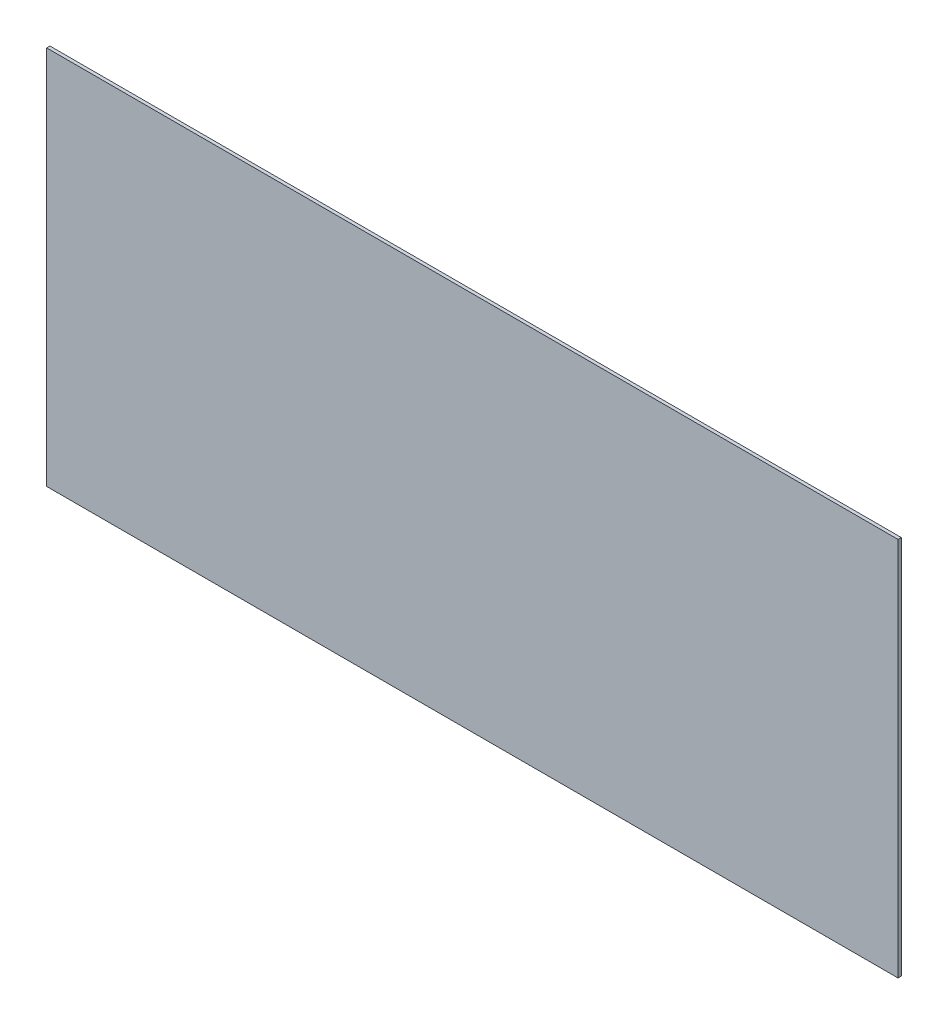
ISO-10303-21;
HEADER;
FILE_DESCRIPTION(('STEP AP214'),'2;1');
FILE_NAME('part.step','',(''),(''),'','','');
FILE_SCHEMA(('AUTOMOTIVE_DESIGN { 1 0 10303 214 1 1 1 1 }'));
ENDSEC;
DATA;
#1=APPLICATION_CONTEXT('core data for automotive mechanical design processes');
#2=APPLICATION_PROTOCOL_DEFINITION('international standard','automotive_design',2000,#1);
#3=PRODUCT_CONTEXT('',#1,'mechanical');
#4=PRODUCT('Part','Part','',(#3));
#5=PRODUCT_RELATED_PRODUCT_CATEGORY('part','',(#4));
#6=PRODUCT_DEFINITION_FORMATION('','',#4);
#7=PRODUCT_DEFINITION_CONTEXT('part definition',#1,'design');
#8=PRODUCT_DEFINITION('design','',#6,#7);
#9=PRODUCT_DEFINITION_SHAPE('','',#8);
#10=(LENGTH_UNIT() NAMED_UNIT(*) SI_UNIT(.MILLI.,.METRE.));
#11=(NAMED_UNIT(*) PLANE_ANGLE_UNIT() SI_UNIT($,.RADIAN.));
#12=(NAMED_UNIT(*) SI_UNIT($,.STERADIAN.) SOLID_ANGLE_UNIT());
#13=UNCERTAINTY_MEASURE_WITH_UNIT(LENGTH_MEASURE(1.E-05),#10,'distance_accuracy_value','');
#14=(GEOMETRIC_REPRESENTATION_CONTEXT(3) GLOBAL_UNCERTAINTY_ASSIGNED_CONTEXT((#13)) GLOBAL_UNIT_ASSIGNED_CONTEXT((#10,
#11,#12)) REPRESENTATION_CONTEXT('',''));
#15=CARTESIAN_POINT('',(0.,0.,0.));
#16=DIRECTION('',(0.,0.,1.));
#17=DIRECTION('',(1.,0.,0.));
#18=AXIS2_PLACEMENT_3D('',#15,#16,#17);
#19=CARTESIAN_POINT('',(0.,0.,0.1));
#20=DIRECTION('',(1.,0.,0.));
#21=DIRECTION('',(0.,0.,-1.));
#22=AXIS2_PLACEMENT_3D('',#19,#20,#21);
#23=PLANE('',#22);
#24=DIRECTION('',(0.,-1.,0.));
#25=VECTOR('',#24,1.);
#26=CARTESIAN_POINT('',(0.,0.,0.));
#27=LINE('',#26,#25);
#28=CARTESIAN_POINT('',(0.,11.6,0.));
#29=VERTEX_POINT('',#28);
#30=CARTESIAN_POINT('',(0.,0.,0.));
#31=VERTEX_POINT('',#30);
#32=EDGE_CURVE('E107',#29,#31,#27,.T.);
#33=ORIENTED_EDGE('',*,*,#32,.T.);
#34=DIRECTION('',(0.,0.,-1.));
#35=VECTOR('',#34,1.);
#36=CARTESIAN_POINT('',(0.,0.,0.1));
#37=LINE('',#36,#35);
#38=CARTESIAN_POINT('',(0.,0.,0.1));
#39=VERTEX_POINT('',#38);
#40=EDGE_CURVE('E11',#39,#31,#37,.T.);
#41=ORIENTED_EDGE('',*,*,#40,.F.);
#42=DIRECTION('',(0.,-1.,0.));
#43=VECTOR('',#42,1.);
#44=CARTESIAN_POINT('',(0.,0.,0.1));
#45=LINE('',#44,#43);
#46=CARTESIAN_POINT('',(0.,11.6,0.1));
#47=VERTEX_POINT('',#46);
#48=EDGE_CURVE('E91',#47,#39,#45,.T.);
#49=ORIENTED_EDGE('',*,*,#48,.F.);
#50=DIRECTION('',(0.,0.,-1.));
#51=VECTOR('',#50,1.);
#52=CARTESIAN_POINT('',(0.,11.6,0.1));
#53=LINE('',#52,#51);
#54=EDGE_CURVE('E103',#47,#29,#53,.T.);
#55=ORIENTED_EDGE('',*,*,#54,.T.);
#56=EDGE_LOOP('',(#33,#41,#49,#55));
#57=FACE_BOUND('',#56,.T.);
#58=ADVANCED_FACE('F39',(#57),#23,.F.);
#59=CARTESIAN_POINT('',(0.,0.,0.1));
#60=DIRECTION('',(0.,1.,0.));
#61=DIRECTION('',(0.,0.,1.));
#62=AXIS2_PLACEMENT_3D('',#59,#60,#61);
#63=PLANE('',#62);
#64=DIRECTION('',(1.,0.,0.));
#65=VECTOR('',#64,1.);
#66=CARTESIAN_POINT('',(0.,0.,0.));
#67=LINE('',#66,#65);
#68=CARTESIAN_POINT('',(26.,0.,0.));
#69=VERTEX_POINT('',#68);
#70=EDGE_CURVE('E96',#31,#69,#67,.T.);
#71=ORIENTED_EDGE('',*,*,#70,.T.);
#72=DIRECTION('',(0.,0.,-1.));
#73=VECTOR('',#72,1.);
#74=CARTESIAN_POINT('',(26.,0.,0.1));
#75=LINE('',#74,#73);
#76=CARTESIAN_POINT('',(26.,0.,0.1));
#77=VERTEX_POINT('',#76);
#78=EDGE_CURVE('E48',#77,#69,#75,.T.);
#79=ORIENTED_EDGE('',*,*,#78,.F.);
#80=DIRECTION('',(1.,0.,0.));
#81=VECTOR('',#80,1.);
#82=CARTESIAN_POINT('',(0.,0.,0.1));
#83=LINE('',#82,#81);
#84=EDGE_CURVE('E86',#39,#77,#83,.T.);
#85=ORIENTED_EDGE('',*,*,#84,.F.);
#86=ORIENTED_EDGE('',*,*,#40,.T.);
#87=EDGE_LOOP('',(#71,#79,#85,#86));
#88=FACE_BOUND('',#87,.T.);
#89=ADVANCED_FACE('F95',(#88),#63,.F.);
#90=CARTESIAN_POINT('',(26.,0.,0.1));
#91=DIRECTION('',(-1.,0.,0.));
#92=DIRECTION('',(0.,0.,1.));
#93=AXIS2_PLACEMENT_3D('',#90,#91,#92);
#94=PLANE('',#93);
#95=DIRECTION('',(0.,1.,0.));
#96=VECTOR('',#95,1.);
#97=CARTESIAN_POINT('',(26.,0.,0.));
#98=LINE('',#97,#96);
#99=CARTESIAN_POINT('',(26.,11.6,0.));
#100=VERTEX_POINT('',#99);
#101=EDGE_CURVE('E73',#69,#100,#98,.T.);
#102=ORIENTED_EDGE('',*,*,#101,.T.);
#103=DIRECTION('',(0.,0.,-1.));
#104=VECTOR('',#103,1.);
#105=CARTESIAN_POINT('',(26.,11.6,0.1));
#106=LINE('',#105,#104);
#107=CARTESIAN_POINT('',(26.,11.6,0.1));
#108=VERTEX_POINT('',#107);
#109=EDGE_CURVE('E98',#108,#100,#106,.T.);
#110=ORIENTED_EDGE('',*,*,#109,.F.);
#111=DIRECTION('',(0.,1.,0.));
#112=VECTOR('',#111,1.);
#113=CARTESIAN_POINT('',(26.,0.,0.1));
#114=LINE('',#113,#112);
#115=EDGE_CURVE('E89',#77,#108,#114,.T.);
#116=ORIENTED_EDGE('',*,*,#115,.F.);
#117=ORIENTED_EDGE('',*,*,#78,.T.);
#118=EDGE_LOOP('',(#102,#110,#116,#117));
#119=FACE_BOUND('',#118,.T.);
#120=ADVANCED_FACE('F99',(#119),#94,.F.);
#121=CARTESIAN_POINT('',(0.,11.6,0.1));
#122=DIRECTION('',(0.,-1.,0.));
#123=DIRECTION('',(0.,0.,-1.));
#124=AXIS2_PLACEMENT_3D('',#121,#122,#123);
#125=PLANE('',#124);
#126=DIRECTION('',(-1.,0.,0.));
#127=VECTOR('',#126,1.);
#128=CARTESIAN_POINT('',(0.,11.6,0.));
#129=LINE('',#128,#127);
#130=EDGE_CURVE('E79',#100,#29,#129,.T.);
#131=ORIENTED_EDGE('',*,*,#130,.T.);
#132=ORIENTED_EDGE('',*,*,#54,.F.);
#133=DIRECTION('',(-1.,0.,0.));
#134=VECTOR('',#133,1.);
#135=CARTESIAN_POINT('',(0.,11.6,0.1));
#136=LINE('',#135,#134);
#137=EDGE_CURVE('E56',#108,#47,#136,.T.);
#138=ORIENTED_EDGE('',*,*,#137,.F.);
#139=ORIENTED_EDGE('',*,*,#109,.T.);
#140=EDGE_LOOP('',(#131,#132,#138,#139));
#141=FACE_BOUND('',#140,.T.);
#142=ADVANCED_FACE('F120',(#141),#125,.F.);
#143=CARTESIAN_POINT('',(0.,0.,0.1));
#144=DIRECTION('',(0.,0.,-1.));
#145=DIRECTION('',(-1.,0.,0.));
#146=AXIS2_PLACEMENT_3D('',#143,#144,#145);
#147=PLANE('',#146);
#148=ORIENTED_EDGE('',*,*,#48,.T.);
#149=ORIENTED_EDGE('',*,*,#84,.T.);
#150=ORIENTED_EDGE('',*,*,#115,.T.);
#151=ORIENTED_EDGE('',*,*,#137,.T.);
#152=EDGE_LOOP('',(#148,#149,#150,#151));
#153=FACE_BOUND('',#152,.T.);
#154=ADVANCED_FACE('F87',(#153),#147,.F.);
#155=CARTESIAN_POINT('',(0.,0.,0.));
#156=DIRECTION('',(0.,0.,-1.));
#157=DIRECTION('',(-1.,0.,0.));
#158=AXIS2_PLACEMENT_3D('',#155,#156,#157);
#159=PLANE('',#158);
#160=ORIENTED_EDGE('',*,*,#32,.F.);
#161=ORIENTED_EDGE('',*,*,#130,.F.);
#162=ORIENTED_EDGE('',*,*,#101,.F.);
#163=ORIENTED_EDGE('',*,*,#70,.F.);
#164=EDGE_LOOP('',(#160,#161,#162,#163));
#165=FACE_BOUND('',#164,.T.);
#166=ADVANCED_FACE('F123',(#165),#159,.T.);
#167=CLOSED_SHELL('',(#58,#89,#120,#142,#154,#166));
#168=MANIFOLD_SOLID_BREP('B2',#167);
#169=ADVANCED_BREP_SHAPE_REPRESENTATION('',(#18,#168),#14);
#170=SHAPE_DEFINITION_REPRESENTATION(#9,#169);
ENDSEC;
END-ISO-10303-21;
